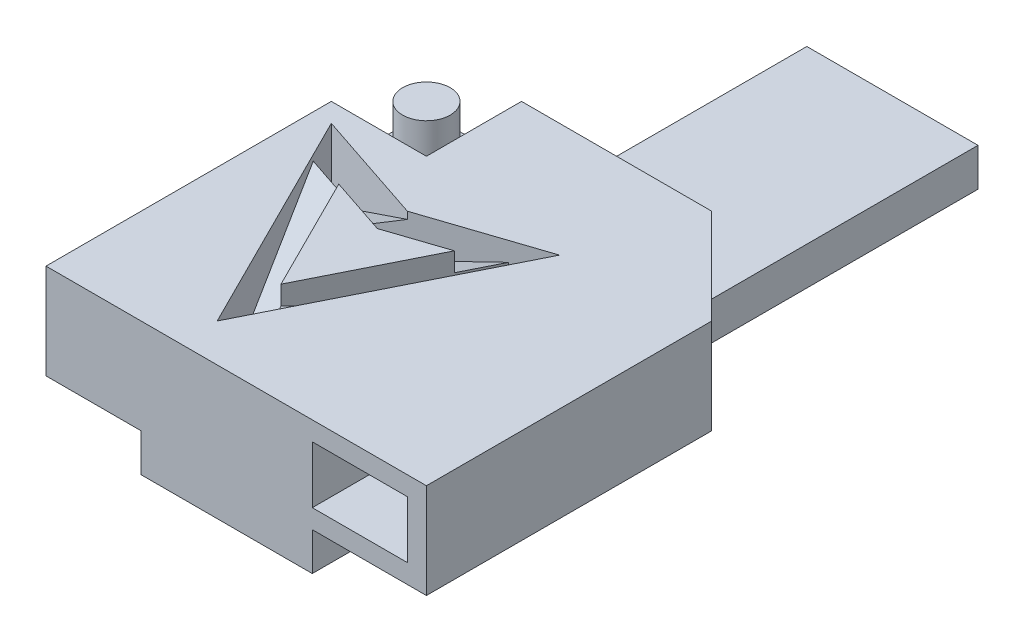
ISO-10303-21;
HEADER;
FILE_DESCRIPTION(('STEP AP214'),'2;1');
FILE_NAME('part.step','',(''),(''),'','','');
FILE_SCHEMA(('AUTOMOTIVE_DESIGN { 1 0 10303 214 1 1 1 1 }'));
ENDSEC;
DATA;
#1=APPLICATION_CONTEXT('core data for automotive mechanical design processes');
#2=APPLICATION_PROTOCOL_DEFINITION('international standard','automotive_design',2000,#1);
#3=PRODUCT_CONTEXT('',#1,'mechanical');
#4=PRODUCT('Part','Part','',(#3));
#5=PRODUCT_RELATED_PRODUCT_CATEGORY('part','',(#4));
#6=PRODUCT_DEFINITION_FORMATION('','',#4);
#7=PRODUCT_DEFINITION_CONTEXT('part definition',#1,'design');
#8=PRODUCT_DEFINITION('design','',#6,#7);
#9=PRODUCT_DEFINITION_SHAPE('','',#8);
#10=(LENGTH_UNIT() NAMED_UNIT(*) SI_UNIT(.MILLI.,.METRE.));
#11=(NAMED_UNIT(*) PLANE_ANGLE_UNIT() SI_UNIT($,.RADIAN.));
#12=(NAMED_UNIT(*) SI_UNIT($,.STERADIAN.) SOLID_ANGLE_UNIT());
#13=UNCERTAINTY_MEASURE_WITH_UNIT(LENGTH_MEASURE(1.E-05),#10,'distance_accuracy_value','');
#14=(GEOMETRIC_REPRESENTATION_CONTEXT(3) GLOBAL_UNCERTAINTY_ASSIGNED_CONTEXT((#13)) GLOBAL_UNIT_ASSIGNED_CONTEXT((#10,
#11,#12)) REPRESENTATION_CONTEXT('',''));
#15=CARTESIAN_POINT('',(0.,0.,0.));
#16=DIRECTION('',(0.,0.,1.));
#17=DIRECTION('',(1.,0.,0.));
#18=AXIS2_PLACEMENT_3D('',#15,#16,#17);
#19=CARTESIAN_POINT('',(0.,0.,0.));
#20=DIRECTION('',(0.,-1.,0.));
#21=DIRECTION('',(0.,0.,-1.));
#22=AXIS2_PLACEMENT_3D('',#19,#20,#21);
#23=PLANE('',#22);
#24=DIRECTION('',(1.,0.,0.));
#25=VECTOR('',#24,1.);
#26=CARTESIAN_POINT('',(-10.,0.,10.));
#27=LINE('',#26,#25);
#28=CARTESIAN_POINT('',(4.,0.,10.));
#29=VERTEX_POINT('',#28);
#30=CARTESIAN_POINT('',(10.,0.,10.));
#31=VERTEX_POINT('',#30);
#32=EDGE_CURVE('E59',#29,#31,#27,.T.);
#33=ORIENTED_EDGE('',*,*,#32,.F.);
#34=DIRECTION('',(0.,0.,-1.));
#35=VECTOR('',#34,1.);
#36=CARTESIAN_POINT('',(4.,0.,10.));
#37=LINE('',#36,#35);
#38=CARTESIAN_POINT('',(4.,0.,-10.));
#39=VERTEX_POINT('',#38);
#40=EDGE_CURVE('E1017',#29,#39,#37,.T.);
#41=ORIENTED_EDGE('',*,*,#40,.T.);
#42=DIRECTION('',(-1.,0.,0.));
#43=VECTOR('',#42,1.);
#44=CARTESIAN_POINT('',(-10.,0.,-10.));
#45=LINE('',#44,#43);
#46=CARTESIAN_POINT('',(5.,0.,-10.));
#47=VERTEX_POINT('',#46);
#48=EDGE_CURVE('E320',#47,#39,#45,.T.);
#49=ORIENTED_EDGE('',*,*,#48,.F.);
#50=DIRECTION('',(-0.707106781186547,0.,-0.707106781186548));
#51=VECTOR('',#50,1.);
#52=CARTESIAN_POINT('',(5.,0.,-10.));
#53=LINE('',#52,#51);
#54=CARTESIAN_POINT('',(10.,0.,-5.));
#55=VERTEX_POINT('',#54);
#56=EDGE_CURVE('E345',#55,#47,#53,.T.);
#57=ORIENTED_EDGE('',*,*,#56,.F.);
#58=DIRECTION('',(0.,0.,-1.));
#59=VECTOR('',#58,1.);
#60=CARTESIAN_POINT('',(10.,0.,10.));
#61=LINE('',#60,#59);
#62=EDGE_CURVE('E342',#31,#55,#61,.T.);
#63=ORIENTED_EDGE('',*,*,#62,.F.);
#64=EDGE_LOOP('',(#33,#41,#49,#57,#63));
#65=FACE_BOUND('',#64,.T.);
#66=ADVANCED_FACE('F43',(#65),#23,.T.);
#67=CARTESIAN_POINT('',(0.,2.,0.));
#68=DIRECTION('',(0.,1.,0.));
#69=DIRECTION('',(0.,0.,1.));
#70=AXIS2_PLACEMENT_3D('',#67,#68,#69);
#71=PLANE('',#70);
#72=DIRECTION('',(-0.948683298050514,0.,0.316227766016838));
#73=VECTOR('',#72,1.);
#74=CARTESIAN_POINT('',(-3.,2.,-2.));
#75=LINE('',#74,#73);
#76=CARTESIAN_POINT('',(3.,2.,-4.));
#77=VERTEX_POINT('',#76);
#78=CARTESIAN_POINT('',(0.987538820250192,2.,-3.32917960675006));
#79=VERTEX_POINT('',#78);
#80=EDGE_CURVE('E275',#77,#79,#75,.T.);
#81=ORIENTED_EDGE('',*,*,#80,.T.);
#82=DIRECTION('',(-0.447213595499957,0.,-0.894427190999916));
#83=VECTOR('',#82,1.);
#84=CARTESIAN_POINT('',(8.12259732609117,2.,10.9409374049319));
#85=LINE('',#84,#83);
#86=CARTESIAN_POINT('',(1.82606431181261,2.,-1.65212862362523));
#87=VERTEX_POINT('',#86);
#88=EDGE_CURVE('E416',#87,#79,#85,.T.);
#89=ORIENTED_EDGE('',*,*,#88,.F.);
#90=DIRECTION('',(0.447213595499958,0.,-0.894427190999916));
#91=VECTOR('',#90,1.);
#92=CARTESIAN_POINT('',(3.,2.,-4.));
#93=LINE('',#92,#91);
#94=EDGE_CURVE('E512',#87,#77,#93,.T.);
#95=ORIENTED_EDGE('',*,*,#94,.T.);
#96=EDGE_LOOP('',(#81,#89,#95));
#97=FACE_BOUND('',#96,.T.);
#98=ADVANCED_FACE('F544',(#97),#71,.T.);
#99=CARTESIAN_POINT('',(3.,2.,-4.));
#100=DIRECTION('',(0.894427190999916,0.,0.447213595499958));
#101=DIRECTION('',(0.447213595499958,0.,-0.894427190999916));
#102=AXIS2_PLACEMENT_3D('',#99,#100,#101);
#103=PLANE('',#102);
#104=DIRECTION('',(0.,-1.,0.));
#105=VECTOR('',#104,1.);
#106=CARTESIAN_POINT('',(-2.16147450843758,4.,6.32294901687516));
#107=LINE('',#106,#105);
#108=CARTESIAN_POINT('',(-2.16147450843758,4.,6.32294901687515));
#109=VERTEX_POINT('',#108);
#110=CARTESIAN_POINT('',(-2.16147450843758,2.,6.32294901687515));
#111=VERTEX_POINT('',#110);
#112=EDGE_CURVE('E402',#109,#111,#107,.T.);
#113=ORIENTED_EDGE('',*,*,#112,.T.);
#114=CARTESIAN_POINT('',(-3.,2.,8.));
#115=VERTEX_POINT('',#114);
#116=EDGE_CURVE('E532',#115,#111,#93,.T.);
#117=ORIENTED_EDGE('',*,*,#116,.F.);
#118=DIRECTION('',(0.,1.,0.));
#119=VECTOR('',#118,1.);
#120=CARTESIAN_POINT('',(-3.,2.,8.));
#121=LINE('',#120,#119);
#122=CARTESIAN_POINT('',(-3.,5.,8.));
#123=VERTEX_POINT('',#122);
#124=EDGE_CURVE('E515',#115,#123,#121,.T.);
#125=ORIENTED_EDGE('',*,*,#124,.T.);
#126=DIRECTION('',(0.447213595499958,0.,-0.894427190999916));
#127=VECTOR('',#126,1.);
#128=CARTESIAN_POINT('',(3.,5.,-4.));
#129=LINE('',#128,#127);
#130=CARTESIAN_POINT('',(3.,5.,-4.));
#131=VERTEX_POINT('',#130);
#132=EDGE_CURVE('E280',#123,#131,#129,.T.);
#133=ORIENTED_EDGE('',*,*,#132,.T.);
#134=DIRECTION('',(0.,1.,0.));
#135=VECTOR('',#134,1.);
#136=CARTESIAN_POINT('',(3.,2.,-4.));
#137=LINE('',#136,#135);
#138=EDGE_CURVE('E467',#77,#131,#137,.T.);
#139=ORIENTED_EDGE('',*,*,#138,.F.);
#140=ORIENTED_EDGE('',*,*,#94,.F.);
#141=DIRECTION('',(-0.436370747100067,0.218867209459637,0.872741494200133));
#142=VECTOR('',#141,1.);
#143=CARTESIAN_POINT('',(-1.77088235054016,3.80409361488152,5.54176470108032));
#144=LINE('',#143,#142);
#145=EDGE_CURVE('E419',#87,#109,#144,.T.);
#146=ORIENTED_EDGE('',*,*,#145,.T.);
#147=EDGE_LOOP('',(#113,#117,#125,#133,#139,#140,#146));
#148=FACE_BOUND('',#147,.T.);
#149=ADVANCED_FACE('F547',(#148),#103,.F.);
#150=CARTESIAN_POINT('',(0.0388555221996776,2.,-1.43181301064903));
#151=DIRECTION('',(0.894427190999916,0.,0.447213595499958));
#152=DIRECTION('',(0.447213595499958,0.,-0.894427190999916));
#153=AXIS2_PLACEMENT_3D('',#150,#151,#152);
#154=PLANE('',#153);
#155=DIRECTION('',(0.,1.,0.));
#156=VECTOR('',#155,1.);
#157=CARTESIAN_POINT('',(-3.,2.,4.64589803375032));
#158=LINE('',#157,#156);
#159=CARTESIAN_POINT('',(-3.,4.,4.64589803375032));
#160=VERTEX_POINT('',#159);
#161=CARTESIAN_POINT('',(-3.,5.,4.64589803375032));
#162=VERTEX_POINT('',#161);
#163=EDGE_CURVE('E293',#160,#162,#158,.T.);
#164=ORIENTED_EDGE('',*,*,#163,.F.);
#165=DIRECTION('',(-0.436370747100067,0.218867209459637,0.872741494200133));
#166=VECTOR('',#165,1.);
#167=CARTESIAN_POINT('',(0.987538820250192,2.,-3.32917960675006));
#168=LINE('',#167,#166);
#169=EDGE_CURVE('E410',#79,#160,#168,.T.);
#170=ORIENTED_EDGE('',*,*,#169,.F.);
#171=DIRECTION('',(0.,1.,0.));
#172=VECTOR('',#171,1.);
#173=CARTESIAN_POINT('',(0.987538820250192,4.,-3.32917960675006));
#174=LINE('',#173,#172);
#175=CARTESIAN_POINT('',(0.987538820250192,4.,-3.32917960675006));
#176=VERTEX_POINT('',#175);
#177=EDGE_CURVE('E439',#79,#176,#174,.T.);
#178=ORIENTED_EDGE('',*,*,#177,.T.);
#179=DIRECTION('',(0.447213595499958,0.,-0.894427190999916));
#180=VECTOR('',#179,1.);
#181=CARTESIAN_POINT('',(-6.54253521369087,4.,11.7309684611321));
#182=LINE('',#181,#180);
#183=CARTESIAN_POINT('',(0.0388555221996776,4.,-1.43181301064903));
#184=VERTEX_POINT('',#183);
#185=EDGE_CURVE('E431',#184,#176,#182,.T.);
#186=ORIENTED_EDGE('',*,*,#185,.F.);
#187=DIRECTION('',(0.,1.,0.));
#188=VECTOR('',#187,1.);
#189=CARTESIAN_POINT('',(0.0388555221996776,2.,-1.43181301064903));
#190=LINE('',#189,#188);
#191=CARTESIAN_POINT('',(0.0388555221996776,5.,-1.43181301064903));
#192=VERTEX_POINT('',#191);
#193=EDGE_CURVE('E296',#184,#192,#190,.T.);
#194=ORIENTED_EDGE('',*,*,#193,.T.);
#195=DIRECTION('',(0.447213595499958,0.,-0.894427190999916));
#196=VECTOR('',#195,1.);
#197=CARTESIAN_POINT('',(0.0388555221996776,5.,-1.43181301064903));
#198=LINE('',#197,#196);
#199=EDGE_CURVE('E289',#162,#192,#198,.T.);
#200=ORIENTED_EDGE('',*,*,#199,.F.);
#201=EDGE_LOOP('',(#164,#170,#178,#186,#194,#200));
#202=FACE_BOUND('',#201,.T.);
#203=ADVANCED_FACE('F557',(#202),#154,.T.);
#204=CARTESIAN_POINT('',(-6.03885552219967,2.,-1.43181301064903));
#205=DIRECTION('',(0.316227766016838,0.,-0.948683298050514));
#206=DIRECTION('',(-0.948683298050514,0.,-0.316227766016838));
#207=AXIS2_PLACEMENT_3D('',#204,#205,#206);
#208=PLANE('',#207);
#209=DIRECTION('',(0.,1.,0.));
#210=VECTOR('',#209,1.);
#211=CARTESIAN_POINT('',(-3.,2.,-0.418861169915809));
#212=LINE('',#211,#210);
#213=CARTESIAN_POINT('',(-3.,3.04427191113709,-0.418861169915804));
#214=VERTEX_POINT('',#213);
#215=CARTESIAN_POINT('',(-3.,5.,-0.418861169915809));
#216=VERTEX_POINT('',#215);
#217=EDGE_CURVE('E286',#214,#216,#212,.T.);
#218=ORIENTED_EDGE('',*,*,#217,.F.);
#219=DIRECTION('',(0.875383444305222,0.385434567780787,0.291794481435074));
#220=VECTOR('',#219,1.);
#221=CARTESIAN_POINT('',(-7.29513055392305,1.15311004443384,-1.85057135455682));
#222=LINE('',#221,#220);
#223=CARTESIAN_POINT('',(-5.37170824512629,2.,-1.2094305849579));
#224=VERTEX_POINT('',#223);
#225=EDGE_CURVE('E428',#224,#214,#222,.T.);
#226=ORIENTED_EDGE('',*,*,#225,.F.);
#227=DIRECTION('',(0.,-1.,0.));
#228=VECTOR('',#227,1.);
#229=CARTESIAN_POINT('',(-5.37170824512629,3.5,-1.2094305849579));
#230=LINE('',#229,#228);
#231=CARTESIAN_POINT('',(-5.37170824512628,3.5,-1.2094305849579));
#232=VERTEX_POINT('',#231);
#233=EDGE_CURVE('E438',#232,#224,#230,.T.);
#234=ORIENTED_EDGE('',*,*,#233,.F.);
#235=DIRECTION('',(0.837864106912505,0.469022314498422,0.279288035637501));
#236=VECTOR('',#235,1.);
#237=CARTESIAN_POINT('',(-8.05131670194948,2.,-2.10263340389896));
#238=LINE('',#237,#236);
#239=CARTESIAN_POINT('',(-8.05131670194949,1.99999999999999,-2.10263340389897));
#240=VERTEX_POINT('',#239);
#241=EDGE_CURVE('E445',#240,#232,#238,.T.);
#242=ORIENTED_EDGE('',*,*,#241,.F.);
#243=DIRECTION('',(0.,-1.,0.));
#244=VECTOR('',#243,1.);
#245=CARTESIAN_POINT('',(-8.05131670194948,2.,-2.10263340389897));
#246=LINE('',#245,#244);
#247=CARTESIAN_POINT('',(-8.05131670194948,4.7,-2.10263340389897));
#248=VERTEX_POINT('',#247);
#249=EDGE_CURVE('E463',#248,#240,#246,.T.);
#250=ORIENTED_EDGE('',*,*,#249,.F.);
#251=DIRECTION('',(0.948683298050514,0.,0.316227766016838));
#252=VECTOR('',#251,1.);
#253=CARTESIAN_POINT('',(-17.9923105362645,4.7,-5.41629801533731));
#254=LINE('',#253,#252);
#255=CARTESIAN_POINT('',(-6.03885552219967,4.7,-1.43181301064903));
#256=VERTEX_POINT('',#255);
#257=EDGE_CURVE('E455',#248,#256,#254,.T.);
#258=ORIENTED_EDGE('',*,*,#257,.T.);
#259=DIRECTION('',(0.,1.,0.));
#260=VECTOR('',#259,1.);
#261=CARTESIAN_POINT('',(-6.03885552219967,2.,-1.43181301064903));
#262=LINE('',#261,#260);
#263=CARTESIAN_POINT('',(-6.03885552219967,5.,-1.43181301064903));
#264=VERTEX_POINT('',#263);
#265=EDGE_CURVE('E290',#256,#264,#262,.T.);
#266=ORIENTED_EDGE('',*,*,#265,.T.);
#267=DIRECTION('',(-0.948683298050514,0.,-0.316227766016838));
#268=VECTOR('',#267,1.);
#269=CARTESIAN_POINT('',(-6.03885552219967,5.,-1.43181301064903));
#270=LINE('',#269,#268);
#271=EDGE_CURVE('E307',#216,#264,#270,.T.);
#272=ORIENTED_EDGE('',*,*,#271,.F.);
#273=EDGE_LOOP('',(#218,#226,#234,#242,#250,#258,#266,#272));
#274=FACE_BOUND('',#273,.T.);
#275=ADVANCED_FACE('F583',(#274),#208,.T.);
#276=CARTESIAN_POINT('',(-3.,2.,-2.));
#277=DIRECTION('',(-0.316227766016838,0.,-0.948683298050514));
#278=DIRECTION('',(-0.948683298050514,0.,0.316227766016838));
#279=AXIS2_PLACEMENT_3D('',#276,#277,#278);
#280=PLANE('',#279);
#281=DIRECTION('',(0.,1.,0.));
#282=VECTOR('',#281,1.);
#283=CARTESIAN_POINT('',(-3.,2.,-2.));
#284=LINE('',#283,#282);
#285=CARTESIAN_POINT('',(-2.99999999999999,4.625,-2.));
#286=VERTEX_POINT('',#285);
#287=CARTESIAN_POINT('',(-3.,5.,-2.));
#288=VERTEX_POINT('',#287);
#289=EDGE_CURVE('E509',#286,#288,#284,.T.);
#290=ORIENTED_EDGE('',*,*,#289,.F.);
#291=DIRECTION('',(-0.865124701092709,-0.410364677328797,0.288374900364236));
#292=VECTOR('',#291,1.);
#293=CARTESIAN_POINT('',(-5.37170824512628,3.5,-1.20943058495791));
#294=LINE('',#293,#292);
#295=EDGE_CURVE('E256',#286,#232,#294,.T.);
#296=ORIENTED_EDGE('',*,*,#295,.T.);
#297=ORIENTED_EDGE('',*,*,#233,.T.);
#298=DIRECTION('',(-0.909082260596594,-0.285908772296701,0.303027420198865));
#299=VECTOR('',#298,1.);
#300=CARTESIAN_POINT('',(-5.37170824512629,2.,-1.2094305849579));
#301=LINE('',#300,#299);
#302=EDGE_CURVE('E435',#176,#224,#301,.T.);
#303=ORIENTED_EDGE('',*,*,#302,.F.);
#304=ORIENTED_EDGE('',*,*,#177,.F.);
#305=ORIENTED_EDGE('',*,*,#80,.F.);
#306=ORIENTED_EDGE('',*,*,#138,.T.);
#307=DIRECTION('',(-0.948683298050514,0.,0.316227766016838));
#308=VECTOR('',#307,1.);
#309=CARTESIAN_POINT('',(-3.,5.,-2.));
#310=LINE('',#309,#308);
#311=EDGE_CURVE('E299',#131,#288,#310,.T.);
#312=ORIENTED_EDGE('',*,*,#311,.T.);
#313=EDGE_LOOP('',(#290,#296,#297,#303,#304,#305,#306,#312));
#314=FACE_BOUND('',#313,.T.);
#315=ADVANCED_FACE('F552',(#314),#280,.F.);
#316=CARTESIAN_POINT('',(-3.,2.,-0.418861169915809));
#317=DIRECTION('',(-0.316227766016838,0.,-0.948683298050514));
#318=DIRECTION('',(-0.948683298050514,0.,0.316227766016838));
#319=AXIS2_PLACEMENT_3D('',#316,#317,#318);
#320=PLANE('',#319);
#321=ORIENTED_EDGE('',*,*,#193,.F.);
#322=DIRECTION('',(0.909082260596594,0.285908772296701,-0.303027420198865));
#323=VECTOR('',#322,1.);
#324=CARTESIAN_POINT('',(-15.3854955575313,-0.850999157969609,3.7096373492613));
#325=LINE('',#324,#323);
#326=EDGE_CURVE('E414',#214,#184,#325,.T.);
#327=ORIENTED_EDGE('',*,*,#326,.F.);
#328=ORIENTED_EDGE('',*,*,#217,.T.);
#329=DIRECTION('',(-0.948683298050514,0.,0.316227766016838));
#330=VECTOR('',#329,1.);
#331=CARTESIAN_POINT('',(-3.,5.,-0.418861169915809));
#332=LINE('',#331,#330);
#333=EDGE_CURVE('E311',#192,#216,#332,.T.);
#334=ORIENTED_EDGE('',*,*,#333,.F.);
#335=EDGE_LOOP('',(#321,#327,#328,#334));
#336=FACE_BOUND('',#335,.T.);
#337=ADVANCED_FACE('F590',(#336),#320,.T.);
#338=DIRECTION('',(0.240586075025283,0.,-0.970627807402986));
#339=VECTOR('',#338,1.);
#340=CARTESIAN_POINT('',(-7.91736341240443,2.,-2.64305864551724));
#341=LINE('',#340,#339);
#342=CARTESIAN_POINT('',(-7.68931479944057,2.,-3.56310493314686));
#343=VERTEX_POINT('',#342);
#344=EDGE_CURVE('E254',#240,#343,#341,.T.);
#345=ORIENTED_EDGE('',*,*,#344,.T.);
#346=DIRECTION('',(-0.948683298050514,0.,-0.316227766016838));
#347=VECTOR('',#346,1.);
#348=CARTESIAN_POINT('',(-9.,2.,-4.));
#349=LINE('',#348,#347);
#350=CARTESIAN_POINT('',(-9.,2.,-4.));
#351=VERTEX_POINT('',#350);
#352=EDGE_CURVE('E265',#343,#351,#349,.T.);
#353=ORIENTED_EDGE('',*,*,#352,.T.);
#354=DIRECTION('',(0.447213595499958,0.,0.894427190999916));
#355=VECTOR('',#354,1.);
#356=CARTESIAN_POINT('',(-3.,2.,8.));
#357=LINE('',#356,#355);
#358=EDGE_CURVE('E268',#351,#240,#357,.T.);
#359=ORIENTED_EDGE('',*,*,#358,.T.);
#360=EDGE_LOOP('',(#345,#353,#359));
#361=FACE_BOUND('',#360,.T.);
#362=ADVANCED_FACE('F264',(#361),#71,.T.);
#363=CARTESIAN_POINT('',(-9.,2.,-4.));
#364=DIRECTION('',(0.316227766016838,0.,-0.948683298050514));
#365=DIRECTION('',(-0.948683298050514,0.,-0.316227766016838));
#366=AXIS2_PLACEMENT_3D('',#363,#364,#365);
#367=PLANE('',#366);
#368=ORIENTED_EDGE('',*,*,#352,.F.);
#369=DIRECTION('',(0.837864106912505,0.469022314498422,0.279288035637501));
#370=VECTOR('',#369,1.);
#371=CARTESIAN_POINT('',(-12.3913053018035,-0.632095646505792,-5.13043510060117));
#372=LINE('',#371,#370);
#373=EDGE_CURVE('E250',#343,#286,#372,.T.);
#374=ORIENTED_EDGE('',*,*,#373,.T.);
#375=ORIENTED_EDGE('',*,*,#289,.T.);
#376=DIRECTION('',(-0.948683298050514,0.,-0.316227766016838));
#377=VECTOR('',#376,1.);
#378=CARTESIAN_POINT('',(-9.,5.,-4.));
#379=LINE('',#378,#377);
#380=CARTESIAN_POINT('',(-9.,5.,-4.));
#381=VERTEX_POINT('',#380);
#382=EDGE_CURVE('E527',#288,#381,#379,.T.);
#383=ORIENTED_EDGE('',*,*,#382,.T.);
#384=DIRECTION('',(0.,1.,0.));
#385=VECTOR('',#384,1.);
#386=CARTESIAN_POINT('',(-9.,2.,-4.));
#387=LINE('',#386,#385);
#388=EDGE_CURVE('E273',#351,#381,#387,.T.);
#389=ORIENTED_EDGE('',*,*,#388,.F.);
#390=EDGE_LOOP('',(#368,#374,#375,#383,#389));
#391=FACE_BOUND('',#390,.T.);
#392=ADVANCED_FACE('F271',(#391),#367,.F.);
#393=CARTESIAN_POINT('',(-3.,2.,8.));
#394=DIRECTION('',(-0.894427190999916,0.,0.447213595499958));
#395=DIRECTION('',(0.447213595499958,0.,0.894427190999916));
#396=AXIS2_PLACEMENT_3D('',#393,#394,#395);
#397=PLANE('',#396);
#398=DIRECTION('',(-0.426988043772352,0.297331552946034,-0.853976087544704));
#399=VECTOR('',#398,1.);
#400=CARTESIAN_POINT('',(-11.0720333061882,6.80346489099123,-8.1440666123764));
#401=LINE('',#400,#399);
#402=CARTESIAN_POINT('',(-4.17393568818739,2.,5.65212862362522));
#403=VERTEX_POINT('',#402);
#404=EDGE_CURVE('E459',#403,#248,#401,.T.);
#405=ORIENTED_EDGE('',*,*,#404,.T.);
#406=ORIENTED_EDGE('',*,*,#249,.T.);
#407=ORIENTED_EDGE('',*,*,#358,.F.);
#408=ORIENTED_EDGE('',*,*,#388,.T.);
#409=DIRECTION('',(0.447213595499958,0.,0.894427190999916));
#410=VECTOR('',#409,1.);
#411=CARTESIAN_POINT('',(-3.,5.,8.));
#412=LINE('',#411,#410);
#413=EDGE_CURVE('E523',#381,#123,#412,.T.);
#414=ORIENTED_EDGE('',*,*,#413,.T.);
#415=ORIENTED_EDGE('',*,*,#124,.F.);
#416=EDGE_CURVE('E282',#403,#115,#357,.T.);
#417=ORIENTED_EDGE('',*,*,#416,.F.);
#418=EDGE_LOOP('',(#405,#406,#407,#408,#414,#415,#417));
#419=FACE_BOUND('',#418,.T.);
#420=ADVANCED_FACE('F570',(#419),#397,.F.);
#421=ORIENTED_EDGE('',*,*,#116,.T.);
#422=DIRECTION('',(0.948683298050514,0.,0.316227766016838));
#423=VECTOR('',#422,1.);
#424=CARTESIAN_POINT('',(-14.1149295225024,2.,2.33846401218688));
#425=LINE('',#424,#423);
#426=EDGE_CURVE('E454',#403,#111,#425,.T.);
#427=ORIENTED_EDGE('',*,*,#426,.F.);
#428=ORIENTED_EDGE('',*,*,#416,.T.);
#429=EDGE_LOOP('',(#421,#427,#428));
#430=FACE_BOUND('',#429,.T.);
#431=ADVANCED_FACE('F567',(#430),#71,.T.);
#432=CARTESIAN_POINT('',(-3.,2.,4.64589803375032));
#433=DIRECTION('',(-0.894427190999916,0.,0.447213595499958));
#434=DIRECTION('',(0.447213595499958,0.,0.894427190999916));
#435=AXIS2_PLACEMENT_3D('',#432,#433,#434);
#436=PLANE('',#435);
#437=ORIENTED_EDGE('',*,*,#265,.F.);
#438=DIRECTION('',(-0.426988043772353,0.297331552946034,-0.853976087544704));
#439=VECTOR('',#438,1.);
#440=CARTESIAN_POINT('',(-6.03885552219968,4.7,-1.43181301064903));
#441=LINE('',#440,#439);
#442=EDGE_CURVE('E448',#111,#256,#441,.T.);
#443=ORIENTED_EDGE('',*,*,#442,.F.);
#444=ORIENTED_EDGE('',*,*,#112,.F.);
#445=DIRECTION('',(-0.447213595499957,0.,-0.894427190999916));
#446=VECTOR('',#445,1.);
#447=CARTESIAN_POINT('',(4.13505850584098,4.,18.9160150454323));
#448=LINE('',#447,#446);
#449=EDGE_CURVE('E415',#109,#160,#448,.T.);
#450=ORIENTED_EDGE('',*,*,#449,.T.);
#451=ORIENTED_EDGE('',*,*,#163,.T.);
#452=DIRECTION('',(0.447213595499958,0.,0.894427190999916));
#453=VECTOR('',#452,1.);
#454=CARTESIAN_POINT('',(-3.,5.,4.64589803375032));
#455=LINE('',#454,#453);
#456=EDGE_CURVE('E303',#264,#162,#455,.T.);
#457=ORIENTED_EDGE('',*,*,#456,.F.);
#458=EDGE_LOOP('',(#437,#443,#444,#450,#451,#457));
#459=FACE_BOUND('',#458,.T.);
#460=ADVANCED_FACE('F596',(#459),#436,.T.);
#461=CARTESIAN_POINT('',(-10.,5.,10.));
#462=DIRECTION('',(1.,0.,0.));
#463=DIRECTION('',(0.,0.,-1.));
#464=AXIS2_PLACEMENT_3D('',#461,#462,#463);
#465=PLANE('',#464);
#466=DIRECTION('',(0.,0.,1.));
#467=VECTOR('',#466,1.);
#468=CARTESIAN_POINT('',(-10.,5.,10.));
#469=LINE('',#468,#467);
#470=CARTESIAN_POINT('',(-10.,5.,-5.));
#471=VERTEX_POINT('',#470);
#472=CARTESIAN_POINT('',(-10.,5.,10.));
#473=VERTEX_POINT('',#472);
#474=EDGE_CURVE('E316',#471,#473,#469,.T.);
#475=ORIENTED_EDGE('',*,*,#474,.F.);
#476=DIRECTION('',(0.,1.,0.));
#477=VECTOR('',#476,1.);
#478=CARTESIAN_POINT('',(-10.,2.,-5.));
#479=LINE('',#478,#477);
#480=CARTESIAN_POINT('',(-10.,2.,-5.));
#481=VERTEX_POINT('',#480);
#482=EDGE_CURVE('E495',#481,#471,#479,.T.);
#483=ORIENTED_EDGE('',*,*,#482,.F.);
#484=DIRECTION('',(0.,0.,1.));
#485=VECTOR('',#484,1.);
#486=CARTESIAN_POINT('',(-10.,2.,-10.));
#487=LINE('',#486,#485);
#488=CARTESIAN_POINT('',(-10.,2.,-10.));
#489=VERTEX_POINT('',#488);
#490=EDGE_CURVE('E479',#489,#481,#487,.T.);
#491=ORIENTED_EDGE('',*,*,#490,.F.);
#492=DIRECTION('',(0.,-1.,0.));
#493=VECTOR('',#492,1.);
#494=CARTESIAN_POINT('',(-10.,5.,-10.));
#495=LINE('',#494,#493);
#496=CARTESIAN_POINT('',(-10.,0.,-10.));
#497=VERTEX_POINT('',#496);
#498=EDGE_CURVE('E333',#489,#497,#495,.T.);
#499=ORIENTED_EDGE('',*,*,#498,.T.);
#500=DIRECTION('',(0.,0.,1.));
#501=VECTOR('',#500,1.);
#502=CARTESIAN_POINT('',(-10.,0.,10.));
#503=LINE('',#502,#501);
#504=CARTESIAN_POINT('',(-10.,0.,10.));
#505=VERTEX_POINT('',#504);
#506=EDGE_CURVE('E334',#497,#505,#503,.T.);
#507=ORIENTED_EDGE('',*,*,#506,.T.);
#508=DIRECTION('',(0.,-1.,0.));
#509=VECTOR('',#508,1.);
#510=CARTESIAN_POINT('',(-10.,5.,10.));
#511=LINE('',#510,#509);
#512=EDGE_CURVE('E370',#473,#505,#511,.T.);
#513=ORIENTED_EDGE('',*,*,#512,.F.);
#514=EDGE_LOOP('',(#475,#483,#491,#499,#507,#513));
#515=FACE_BOUND('',#514,.T.);
#516=ADVANCED_FACE('F45',(#515),#465,.F.);
#517=CARTESIAN_POINT('',(-10.,5.,10.));
#518=DIRECTION('',(0.,0.,-1.));
#519=DIRECTION('',(-1.,0.,0.));
#520=AXIS2_PLACEMENT_3D('',#517,#518,#519);
#521=PLANE('',#520);
#522=DIRECTION('',(-1.,0.,0.));
#523=VECTOR('',#522,1.);
#524=CARTESIAN_POINT('',(9.,4.,10.));
#525=LINE('',#524,#523);
#526=CARTESIAN_POINT('',(9.,4.,10.));
#527=VERTEX_POINT('',#526);
#528=CARTESIAN_POINT('',(4.,4.,10.));
#529=VERTEX_POINT('',#528);
#530=EDGE_CURVE('E1015',#527,#529,#525,.T.);
#531=ORIENTED_EDGE('',*,*,#530,.F.);
#532=DIRECTION('',(0.,1.,0.));
#533=VECTOR('',#532,1.);
#534=CARTESIAN_POINT('',(9.,1.,10.));
#535=LINE('',#534,#533);
#536=CARTESIAN_POINT('',(9.,1.,10.));
#537=VERTEX_POINT('',#536);
#538=EDGE_CURVE('E1003',#537,#527,#535,.T.);
#539=ORIENTED_EDGE('',*,*,#538,.F.);
#540=DIRECTION('',(1.,0.,0.));
#541=VECTOR('',#540,1.);
#542=CARTESIAN_POINT('',(9.,1.,10.));
#543=LINE('',#542,#541);
#544=CARTESIAN_POINT('',(4.,1.,10.));
#545=VERTEX_POINT('',#544);
#546=EDGE_CURVE('E1005',#545,#537,#543,.T.);
#547=ORIENTED_EDGE('',*,*,#546,.F.);
#548=DIRECTION('',(0.,-1.,0.));
#549=VECTOR('',#548,1.);
#550=CARTESIAN_POINT('',(4.,1.,10.));
#551=LINE('',#550,#549);
#552=EDGE_CURVE('E1011',#529,#545,#551,.T.);
#553=ORIENTED_EDGE('',*,*,#552,.F.);
#554=EDGE_LOOP('',(#531,#539,#547,#553));
#555=FACE_BOUND('',#554,.T.);
#556=CARTESIAN_POINT('',(-5.,0.,10.));
#557=VERTEX_POINT('',#556);
#558=EDGE_CURVE('E339',#505,#557,#27,.T.);
#559=ORIENTED_EDGE('',*,*,#558,.T.);
#560=DIRECTION('',(0.,1.,0.));
#561=VECTOR('',#560,1.);
#562=CARTESIAN_POINT('',(-5.,0.,10.));
#563=LINE('',#562,#561);
#564=CARTESIAN_POINT('',(-5.,-2.,10.));
#565=VERTEX_POINT('',#564);
#566=EDGE_CURVE('E1040',#565,#557,#563,.T.);
#567=ORIENTED_EDGE('',*,*,#566,.F.);
#568=DIRECTION('',(-1.,0.,0.));
#569=VECTOR('',#568,1.);
#570=CARTESIAN_POINT('',(4.,-2.,10.));
#571=LINE('',#570,#569);
#572=CARTESIAN_POINT('',(4.,-2.,10.));
#573=VERTEX_POINT('',#572);
#574=EDGE_CURVE('E1049',#573,#565,#571,.T.);
#575=ORIENTED_EDGE('',*,*,#574,.F.);
#576=DIRECTION('',(0.,-1.,0.));
#577=VECTOR('',#576,1.);
#578=CARTESIAN_POINT('',(4.,0.,10.));
#579=LINE('',#578,#577);
#580=EDGE_CURVE('E1053',#29,#573,#579,.T.);
#581=ORIENTED_EDGE('',*,*,#580,.F.);
#582=ORIENTED_EDGE('',*,*,#32,.T.);
#583=DIRECTION('',(0.,-1.,0.));
#584=VECTOR('',#583,1.);
#585=CARTESIAN_POINT('',(10.,5.,10.));
#586=LINE('',#585,#584);
#587=CARTESIAN_POINT('',(10.,5.,10.));
#588=VERTEX_POINT('',#587);
#589=EDGE_CURVE('E366',#588,#31,#586,.T.);
#590=ORIENTED_EDGE('',*,*,#589,.F.);
#591=DIRECTION('',(1.,0.,0.));
#592=VECTOR('',#591,1.);
#593=CARTESIAN_POINT('',(-10.,5.,10.));
#594=LINE('',#593,#592);
#595=EDGE_CURVE('E319',#473,#588,#594,.T.);
#596=ORIENTED_EDGE('',*,*,#595,.F.);
#597=ORIENTED_EDGE('',*,*,#512,.T.);
#598=EDGE_LOOP('',(#559,#567,#575,#581,#582,#590,#596,#597));
#599=FACE_BOUND('',#598,.T.);
#600=ADVANCED_FACE('F603',(#555,#599),#521,.F.);
#601=CARTESIAN_POINT('',(10.,5.,10.));
#602=DIRECTION('',(-1.,0.,0.));
#603=DIRECTION('',(0.,0.,1.));
#604=AXIS2_PLACEMENT_3D('',#601,#602,#603);
#605=PLANE('',#604);
#606=ORIENTED_EDGE('',*,*,#62,.T.);
#607=DIRECTION('',(0.,-1.,0.));
#608=VECTOR('',#607,1.);
#609=CARTESIAN_POINT('',(10.,5.,-5.));
#610=LINE('',#609,#608);
#611=CARTESIAN_POINT('',(10.,5.,-5.));
#612=VERTEX_POINT('',#611);
#613=EDGE_CURVE('E362',#612,#55,#610,.T.);
#614=ORIENTED_EDGE('',*,*,#613,.F.);
#615=DIRECTION('',(0.,0.,-1.));
#616=VECTOR('',#615,1.);
#617=CARTESIAN_POINT('',(10.,5.,10.));
#618=LINE('',#617,#616);
#619=EDGE_CURVE('E323',#588,#612,#618,.T.);
#620=ORIENTED_EDGE('',*,*,#619,.F.);
#621=ORIENTED_EDGE('',*,*,#589,.T.);
#622=EDGE_LOOP('',(#606,#614,#620,#621));
#623=FACE_BOUND('',#622,.T.);
#624=ADVANCED_FACE('F758',(#623),#605,.F.);
#625=CARTESIAN_POINT('',(5.,5.,-10.));
#626=DIRECTION('',(-0.707106781186548,0.,0.707106781186547));
#627=DIRECTION('',(0.707106781186547,0.,0.707106781186548));
#628=AXIS2_PLACEMENT_3D('',#625,#626,#627);
#629=PLANE('',#628);
#630=DIRECTION('',(0.,-1.,0.));
#631=VECTOR('',#630,1.);
#632=CARTESIAN_POINT('',(5.,5.,-10.));
#633=LINE('',#632,#631);
#634=CARTESIAN_POINT('',(5.,1.,-10.));
#635=VERTEX_POINT('',#634);
#636=EDGE_CURVE('E357',#635,#47,#633,.T.);
#637=ORIENTED_EDGE('',*,*,#636,.F.);
#638=DIRECTION('',(0.707106781186547,0.,0.707106781186548));
#639=VECTOR('',#638,1.);
#640=CARTESIAN_POINT('',(5.,0.999999999999999,-10.));
#641=LINE('',#640,#639);
#642=CARTESIAN_POINT('',(9.,1.,-5.99999999999999));
#643=VERTEX_POINT('',#642);
#644=EDGE_CURVE('E397',#635,#643,#641,.T.);
#645=ORIENTED_EDGE('',*,*,#644,.T.);
#646=DIRECTION('',(0.,1.,0.));
#647=VECTOR('',#646,1.);
#648=CARTESIAN_POINT('',(9.,5.,-6.));
#649=LINE('',#648,#647);
#650=CARTESIAN_POINT('',(9.,4.,-5.99999999999999));
#651=VERTEX_POINT('',#650);
#652=EDGE_CURVE('E11',#643,#651,#649,.T.);
#653=ORIENTED_EDGE('',*,*,#652,.T.);
#654=DIRECTION('',(-0.707106781186547,0.,-0.707106781186548));
#655=VECTOR('',#654,1.);
#656=CARTESIAN_POINT('',(5.,4.,-10.));
#657=LINE('',#656,#655);
#658=CARTESIAN_POINT('',(5.,4.,-10.));
#659=VERTEX_POINT('',#658);
#660=EDGE_CURVE('E387',#651,#659,#657,.T.);
#661=ORIENTED_EDGE('',*,*,#660,.T.);
#662=CARTESIAN_POINT('',(5.,5.,-10.));
#663=VERTEX_POINT('',#662);
#664=EDGE_CURVE('E358',#663,#659,#633,.T.);
#665=ORIENTED_EDGE('',*,*,#664,.F.);
#666=DIRECTION('',(-0.707106781186547,0.,-0.707106781186548));
#667=VECTOR('',#666,1.);
#668=CARTESIAN_POINT('',(5.,5.,-10.));
#669=LINE('',#668,#667);
#670=EDGE_CURVE('E326',#612,#663,#669,.T.);
#671=ORIENTED_EDGE('',*,*,#670,.F.);
#672=ORIENTED_EDGE('',*,*,#613,.T.);
#673=ORIENTED_EDGE('',*,*,#56,.T.);
#674=EDGE_LOOP('',(#637,#645,#653,#661,#665,#671,#672,#673));
#675=FACE_BOUND('',#674,.T.);
#676=ADVANCED_FACE('F393',(#675),#629,.F.);
#677=CARTESIAN_POINT('',(-10.,5.,-10.));
#678=DIRECTION('',(0.,0.,1.));
#679=DIRECTION('',(1.,0.,0.));
#680=AXIS2_PLACEMENT_3D('',#677,#678,#679);
#681=PLANE('',#680);
#682=DIRECTION('',(0.,-1.,0.));
#683=VECTOR('',#682,1.);
#684=CARTESIAN_POINT('',(4.,1.,-10.));
#685=LINE('',#684,#683);
#686=CARTESIAN_POINT('',(4.,4.,-10.));
#687=VERTEX_POINT('',#686);
#688=CARTESIAN_POINT('',(4.,1.,-10.));
#689=VERTEX_POINT('',#688);
#690=EDGE_CURVE('E379',#687,#689,#685,.T.);
#691=ORIENTED_EDGE('',*,*,#690,.T.);
#692=DIRECTION('',(1.,0.,0.));
#693=VECTOR('',#692,1.);
#694=CARTESIAN_POINT('',(9.,1.,-10.));
#695=LINE('',#694,#693);
#696=EDGE_CURVE('E1025',#689,#635,#695,.T.);
#697=ORIENTED_EDGE('',*,*,#696,.T.);
#698=ORIENTED_EDGE('',*,*,#636,.T.);
#699=ORIENTED_EDGE('',*,*,#48,.T.);
#700=CARTESIAN_POINT('',(-5.,0.,-10.));
#701=VERTEX_POINT('',#700);
#702=EDGE_CURVE('E353',#39,#701,#45,.T.);
#703=ORIENTED_EDGE('',*,*,#702,.T.);
#704=EDGE_CURVE('E349',#701,#497,#45,.T.);
#705=ORIENTED_EDGE('',*,*,#704,.T.);
#706=ORIENTED_EDGE('',*,*,#498,.F.);
#707=DIRECTION('',(-1.,0.,0.));
#708=VECTOR('',#707,1.);
#709=CARTESIAN_POINT('',(-10.,2.,-10.));
#710=LINE('',#709,#708);
#711=CARTESIAN_POINT('',(-5.,2.,-10.));
#712=VERTEX_POINT('',#711);
#713=EDGE_CURVE('E492',#712,#489,#710,.T.);
#714=ORIENTED_EDGE('',*,*,#713,.F.);
#715=DIRECTION('',(0.,1.,0.));
#716=VECTOR('',#715,1.);
#717=CARTESIAN_POINT('',(-5.,2.,-10.));
#718=LINE('',#717,#716);
#719=CARTESIAN_POINT('',(-5.,5.,-10.));
#720=VERTEX_POINT('',#719);
#721=EDGE_CURVE('E338',#712,#720,#718,.T.);
#722=ORIENTED_EDGE('',*,*,#721,.T.);
#723=DIRECTION('',(-1.,0.,0.));
#724=VECTOR('',#723,1.);
#725=CARTESIAN_POINT('',(-10.,5.,-10.));
#726=LINE('',#725,#724);
#727=EDGE_CURVE('E329',#663,#720,#726,.T.);
#728=ORIENTED_EDGE('',*,*,#727,.F.);
#729=ORIENTED_EDGE('',*,*,#664,.T.);
#730=DIRECTION('',(-1.,0.,0.));
#731=VECTOR('',#730,1.);
#732=CARTESIAN_POINT('',(-10.,4.,-10.));
#733=LINE('',#732,#731);
#734=EDGE_CURVE('E52',#659,#687,#733,.T.);
#735=ORIENTED_EDGE('',*,*,#734,.T.);
#736=EDGE_LOOP('',(#691,#697,#698,#699,#703,#705,#706,#714,#722,#728,#729,#735));
#737=FACE_BOUND('',#736,.T.);
#738=ADVANCED_FACE('F377',(#737),#681,.F.);
#739=CARTESIAN_POINT('',(0.,5.,0.));
#740=DIRECTION('',(0.,-1.,0.));
#741=DIRECTION('',(0.,0.,-1.));
#742=AXIS2_PLACEMENT_3D('',#739,#740,#741);
#743=PLANE('',#742);
#744=ORIENTED_EDGE('',*,*,#382,.F.);
#745=ORIENTED_EDGE('',*,*,#311,.F.);
#746=ORIENTED_EDGE('',*,*,#132,.F.);
#747=ORIENTED_EDGE('',*,*,#413,.F.);
#748=EDGE_LOOP('',(#744,#745,#746,#747));
#749=FACE_BOUND('',#748,.T.);
#750=ORIENTED_EDGE('',*,*,#727,.T.);
#751=DIRECTION('',(0.,0.,-1.));
#752=VECTOR('',#751,1.);
#753=CARTESIAN_POINT('',(-5.,5.,-10.));
#754=LINE('',#753,#752);
#755=CARTESIAN_POINT('',(-5.,5.,-5.));
#756=VERTEX_POINT('',#755);
#757=EDGE_CURVE('E484',#756,#720,#754,.T.);
#758=ORIENTED_EDGE('',*,*,#757,.F.);
#759=DIRECTION('',(1.,0.,0.));
#760=VECTOR('',#759,1.);
#761=CARTESIAN_POINT('',(-10.,5.,-5.));
#762=LINE('',#761,#760);
#763=EDGE_CURVE('E475',#471,#756,#762,.T.);
#764=ORIENTED_EDGE('',*,*,#763,.F.);
#765=ORIENTED_EDGE('',*,*,#474,.T.);
#766=ORIENTED_EDGE('',*,*,#595,.T.);
#767=ORIENTED_EDGE('',*,*,#619,.T.);
#768=ORIENTED_EDGE('',*,*,#670,.T.);
#769=EDGE_LOOP('',(#750,#758,#764,#765,#766,#767,#768));
#770=FACE_BOUND('',#769,.T.);
#771=ADVANCED_FACE('F574',(#749,#770),#743,.F.);
#772=DIRECTION('',(0.,0.,-1.));
#773=VECTOR('',#772,1.);
#774=CARTESIAN_POINT('',(-5.,0.,10.));
#775=LINE('',#774,#773);
#776=EDGE_CURVE('E67',#557,#701,#775,.T.);
#777=ORIENTED_EDGE('',*,*,#776,.F.);
#778=ORIENTED_EDGE('',*,*,#558,.F.);
#779=ORIENTED_EDGE('',*,*,#506,.F.);
#780=ORIENTED_EDGE('',*,*,#704,.F.);
#781=EDGE_LOOP('',(#777,#778,#779,#780));
#782=FACE_BOUND('',#781,.T.);
#783=ADVANCED_FACE('F610',(#782),#23,.T.);
#784=CARTESIAN_POINT('',(-5.,2.,-10.));
#785=DIRECTION('',(1.,0.,0.));
#786=DIRECTION('',(0.,0.,-1.));
#787=AXIS2_PLACEMENT_3D('',#784,#785,#786);
#788=PLANE('',#787);
#789=ORIENTED_EDGE('',*,*,#757,.T.);
#790=ORIENTED_EDGE('',*,*,#721,.F.);
#791=DIRECTION('',(0.,0.,-1.));
#792=VECTOR('',#791,1.);
#793=CARTESIAN_POINT('',(-5.,2.,-10.));
#794=LINE('',#793,#792);
#795=CARTESIAN_POINT('',(-5.,2.,-5.));
#796=VERTEX_POINT('',#795);
#797=EDGE_CURVE('E488',#796,#712,#794,.T.);
#798=ORIENTED_EDGE('',*,*,#797,.F.);
#799=DIRECTION('',(0.,1.,0.));
#800=VECTOR('',#799,1.);
#801=CARTESIAN_POINT('',(-5.,2.,-5.));
#802=LINE('',#801,#800);
#803=EDGE_CURVE('E504',#796,#756,#802,.T.);
#804=ORIENTED_EDGE('',*,*,#803,.T.);
#805=EDGE_LOOP('',(#789,#790,#798,#804));
#806=FACE_BOUND('',#805,.T.);
#807=ADVANCED_FACE('F617',(#806),#788,.F.);
#808=CARTESIAN_POINT('',(-10.,2.,-5.));
#809=DIRECTION('',(0.,0.,1.));
#810=DIRECTION('',(1.,0.,0.));
#811=AXIS2_PLACEMENT_3D('',#808,#809,#810);
#812=PLANE('',#811);
#813=ORIENTED_EDGE('',*,*,#763,.T.);
#814=ORIENTED_EDGE('',*,*,#803,.F.);
#815=DIRECTION('',(1.,0.,0.));
#816=VECTOR('',#815,1.);
#817=CARTESIAN_POINT('',(-10.,2.,-5.));
#818=LINE('',#817,#816);
#819=EDGE_CURVE('E483',#481,#796,#818,.T.);
#820=ORIENTED_EDGE('',*,*,#819,.F.);
#821=ORIENTED_EDGE('',*,*,#482,.T.);
#822=EDGE_LOOP('',(#813,#814,#820,#821));
#823=FACE_BOUND('',#822,.T.);
#824=ADVANCED_FACE('F622',(#823),#812,.F.);
#825=CARTESIAN_POINT('',(0.,2.,0.));
#826=DIRECTION('',(0.,1.,0.));
#827=DIRECTION('',(0.,0.,1.));
#828=AXIS2_PLACEMENT_3D('',#825,#826,#827);
#829=PLANE('',#828);
#830=CARTESIAN_POINT('',(-7.5,2.,-7.5));
#831=DIRECTION('',(0.,1.,0.));
#832=DIRECTION('',(0.,0.,1.));
#833=AXIS2_PLACEMENT_3D('',#830,#831,#832);
#834=CIRCLE('',#833,1.25);
#835=CARTESIAN_POINT('',(-7.5,2.,-6.25));
#836=VERTEX_POINT('',#835);
#837=EDGE_CURVE('E471',#836,#836,#834,.T.);
#838=ORIENTED_EDGE('',*,*,#837,.F.);
#839=EDGE_LOOP('',(#838));
#840=FACE_BOUND('',#839,.T.);
#841=ORIENTED_EDGE('',*,*,#490,.T.);
#842=ORIENTED_EDGE('',*,*,#819,.T.);
#843=ORIENTED_EDGE('',*,*,#797,.T.);
#844=ORIENTED_EDGE('',*,*,#713,.T.);
#845=EDGE_LOOP('',(#841,#842,#843,#844));
#846=FACE_BOUND('',#845,.T.);
#847=ADVANCED_FACE('F636',(#840,#846),#829,.T.);
#848=CARTESIAN_POINT('',(-7.5,2.,-7.5));
#849=DIRECTION('',(0.,1.,0.));
#850=DIRECTION('',(0.,0.,1.));
#851=AXIS2_PLACEMENT_3D('',#848,#849,#850);
#852=CYLINDRICAL_SURFACE('',#851,1.25);
#853=ORIENTED_EDGE('',*,*,#837,.T.);
#854=EDGE_LOOP('',(#853));
#855=FACE_BOUND('',#854,.T.);
#856=CARTESIAN_POINT('',(-7.5,5.,-7.5));
#857=DIRECTION('',(0.,1.,0.));
#858=DIRECTION('',(0.,0.,1.));
#859=AXIS2_PLACEMENT_3D('',#856,#857,#858);
#860=CIRCLE('',#859,1.25);
#861=CARTESIAN_POINT('',(-7.5,5.,-6.25));
#862=VERTEX_POINT('',#861);
#863=EDGE_CURVE('E315',#862,#862,#860,.T.);
#864=ORIENTED_EDGE('',*,*,#863,.F.);
#865=EDGE_LOOP('',(#864));
#866=FACE_BOUND('',#865,.T.);
#867=ADVANCED_FACE('F632',(#855,#866),#852,.T.);
#868=ORIENTED_EDGE('',*,*,#333,.T.);
#869=ORIENTED_EDGE('',*,*,#271,.T.);
#870=ORIENTED_EDGE('',*,*,#456,.T.);
#871=ORIENTED_EDGE('',*,*,#199,.T.);
#872=EDGE_LOOP('',(#868,#869,#870,#871));
#873=FACE_BOUND('',#872,.T.);
#874=ADVANCED_FACE('F594',(#873),#743,.F.);
#875=ORIENTED_EDGE('',*,*,#863,.T.);
#876=EDGE_LOOP('',(#875));
#877=FACE_BOUND('',#876,.T.);
#878=ADVANCED_FACE('F625',(#877),#743,.F.);
#879=CARTESIAN_POINT('',(-17.9923105362645,4.7,-5.41629801533731));
#880=DIRECTION('',(0.127456069905951,-0.915177306559387,-0.382368209717853));
#881=DIRECTION('',(0.,0.385512365018075,-0.92270266956272));
#882=AXIS2_PLACEMENT_3D('',#879,#880,#881);
#883=PLANE('',#882);
#884=ORIENTED_EDGE('',*,*,#404,.F.);
#885=ORIENTED_EDGE('',*,*,#426,.T.);
#886=ORIENTED_EDGE('',*,*,#442,.T.);
#887=ORIENTED_EDGE('',*,*,#257,.F.);
#888=EDGE_LOOP('',(#884,#885,#886,#887));
#889=FACE_BOUND('',#888,.T.);
#890=ADVANCED_FACE('F564',(#889),#883,.F.);
#891=CARTESIAN_POINT('',(-12.9017822790674,2.,13.8507174829242));
#892=DIRECTION('',(0.347716467872878,-0.921339553293199,0.173858233936439));
#893=DIRECTION('',(0.93558791037297,0.353093842999194,0.));
#894=AXIS2_PLACEMENT_3D('',#891,#892,#893);
#895=PLANE('',#894);
#896=ORIENTED_EDGE('',*,*,#225,.T.);
#897=ORIENTED_EDGE('',*,*,#326,.T.);
#898=ORIENTED_EDGE('',*,*,#185,.T.);
#899=ORIENTED_EDGE('',*,*,#302,.T.);
#900=EDGE_LOOP('',(#896,#897,#898,#899));
#901=FACE_BOUND('',#900,.T.);
#902=ADVANCED_FACE('F587',(#901),#895,.F.);
#903=CARTESIAN_POINT('',(8.12259732609117,2.,10.9409374049319));
#904=DIRECTION('',(-0.241469364731472,-0.962868465767897,0.120734682365736));
#905=DIRECTION('',(0.969963934055151,-0.243248775191684,0.));
#906=AXIS2_PLACEMENT_3D('',#903,#904,#905);
#907=PLANE('',#906);
#908=ORIENTED_EDGE('',*,*,#145,.F.);
#909=ORIENTED_EDGE('',*,*,#88,.T.);
#910=ORIENTED_EDGE('',*,*,#169,.T.);
#911=ORIENTED_EDGE('',*,*,#449,.F.);
#912=EDGE_LOOP('',(#908,#909,#910,#911));
#913=FACE_BOUND('',#912,.T.);
#914=ADVANCED_FACE('F561',(#913),#907,.F.);
#915=CARTESIAN_POINT('',(9.,1.,-10.));
#916=DIRECTION('',(1.,0.,0.));
#917=DIRECTION('',(0.,0.,-1.));
#918=AXIS2_PLACEMENT_3D('',#915,#916,#917);
#919=PLANE('',#918);
#920=DIRECTION('',(0.,0.,1.));
#921=VECTOR('',#920,1.);
#922=CARTESIAN_POINT('',(9.,1.,-10.));
#923=LINE('',#922,#921);
#924=EDGE_CURVE('E398',#643,#537,#923,.T.);
#925=ORIENTED_EDGE('',*,*,#924,.T.);
#926=ORIENTED_EDGE('',*,*,#538,.T.);
#927=DIRECTION('',(0.,0.,1.));
#928=VECTOR('',#927,1.);
#929=CARTESIAN_POINT('',(9.,4.,-10.));
#930=LINE('',#929,#928);
#931=EDGE_CURVE('E407',#651,#527,#930,.T.);
#932=ORIENTED_EDGE('',*,*,#931,.F.);
#933=ORIENTED_EDGE('',*,*,#652,.F.);
#934=EDGE_LOOP('',(#925,#926,#932,#933));
#935=FACE_BOUND('',#934,.T.);
#936=ADVANCED_FACE('F918',(#935),#919,.F.);
#937=CARTESIAN_POINT('',(9.,1.,-10.));
#938=DIRECTION('',(0.,-1.,0.));
#939=DIRECTION('',(1.,0.,0.));
#940=AXIS2_PLACEMENT_3D('',#937,#938,#939);
#941=PLANE('',#940);
#942=ORIENTED_EDGE('',*,*,#696,.F.);
#943=DIRECTION('',(0.,0.,1.));
#944=VECTOR('',#943,1.);
#945=CARTESIAN_POINT('',(4.,1.,-10.));
#946=LINE('',#945,#944);
#947=EDGE_CURVE('E404',#689,#545,#946,.T.);
#948=ORIENTED_EDGE('',*,*,#947,.T.);
#949=ORIENTED_EDGE('',*,*,#546,.T.);
#950=ORIENTED_EDGE('',*,*,#924,.F.);
#951=ORIENTED_EDGE('',*,*,#644,.F.);
#952=EDGE_LOOP('',(#942,#948,#949,#950,#951));
#953=FACE_BOUND('',#952,.T.);
#954=ADVANCED_FACE('F909',(#953),#941,.F.);
#955=CARTESIAN_POINT('',(9.,4.,-10.));
#956=DIRECTION('',(0.,1.,0.));
#957=DIRECTION('',(0.,0.,1.));
#958=AXIS2_PLACEMENT_3D('',#955,#956,#957);
#959=PLANE('',#958);
#960=ORIENTED_EDGE('',*,*,#931,.T.);
#961=ORIENTED_EDGE('',*,*,#530,.T.);
#962=DIRECTION('',(0.,0.,1.));
#963=VECTOR('',#962,1.);
#964=CARTESIAN_POINT('',(4.,4.,-10.));
#965=LINE('',#964,#963);
#966=EDGE_CURVE('E390',#687,#529,#965,.T.);
#967=ORIENTED_EDGE('',*,*,#966,.F.);
#968=ORIENTED_EDGE('',*,*,#734,.F.);
#969=ORIENTED_EDGE('',*,*,#660,.F.);
#970=EDGE_LOOP('',(#960,#961,#967,#968,#969));
#971=FACE_BOUND('',#970,.T.);
#972=ADVANCED_FACE('F386',(#971),#959,.F.);
#973=CARTESIAN_POINT('',(4.,1.,-10.));
#974=DIRECTION('',(-1.,0.,0.));
#975=DIRECTION('',(0.,0.,1.));
#976=AXIS2_PLACEMENT_3D('',#973,#974,#975);
#977=PLANE('',#976);
#978=ORIENTED_EDGE('',*,*,#552,.T.);
#979=ORIENTED_EDGE('',*,*,#947,.F.);
#980=ORIENTED_EDGE('',*,*,#690,.F.);
#981=ORIENTED_EDGE('',*,*,#966,.T.);
#982=EDGE_LOOP('',(#978,#979,#980,#981));
#983=FACE_BOUND('',#982,.T.);
#984=ADVANCED_FACE('F796',(#983),#977,.F.);
#985=CARTESIAN_POINT('',(4.,0.,10.));
#986=DIRECTION('',(0.,1.,0.));
#987=DIRECTION('',(0.,0.,1.));
#988=AXIS2_PLACEMENT_3D('',#985,#986,#987);
#989=PLANE('',#988);
#990=ORIENTED_EDGE('',*,*,#702,.F.);
#991=CARTESIAN_POINT('',(4.,0.,-25.));
#992=VERTEX_POINT('',#991);
#993=EDGE_CURVE('E1022',#39,#992,#37,.T.);
#994=ORIENTED_EDGE('',*,*,#993,.T.);
#995=DIRECTION('',(1.,0.,0.));
#996=VECTOR('',#995,1.);
#997=CARTESIAN_POINT('',(4.,0.,-25.));
#998=LINE('',#997,#996);
#999=CARTESIAN_POINT('',(-5.,0.,-25.));
#1000=VERTEX_POINT('',#999);
#1001=EDGE_CURVE('E1057',#1000,#992,#998,.T.);
#1002=ORIENTED_EDGE('',*,*,#1001,.F.);
#1003=EDGE_CURVE('E1043',#701,#1000,#775,.T.);
#1004=ORIENTED_EDGE('',*,*,#1003,.F.);
#1005=EDGE_LOOP('',(#990,#994,#1002,#1004));
#1006=FACE_BOUND('',#1005,.T.);
#1007=ADVANCED_FACE('F790',(#1006),#989,.T.);
#1008=CARTESIAN_POINT('',(4.,0.,10.));
#1009=DIRECTION('',(1.,0.,0.));
#1010=DIRECTION('',(0.,0.,-1.));
#1011=AXIS2_PLACEMENT_3D('',#1008,#1009,#1010);
#1012=PLANE('',#1011);
#1013=DIRECTION('',(0.,0.,-1.));
#1014=VECTOR('',#1013,1.);
#1015=CARTESIAN_POINT('',(4.,-2.,10.));
#1016=LINE('',#1015,#1014);
#1017=CARTESIAN_POINT('',(4.,-2.,-25.));
#1018=VERTEX_POINT('',#1017);
#1019=EDGE_CURVE('E1036',#573,#1018,#1016,.T.);
#1020=ORIENTED_EDGE('',*,*,#1019,.T.);
#1021=DIRECTION('',(0.,-1.,0.));
#1022=VECTOR('',#1021,1.);
#1023=CARTESIAN_POINT('',(4.,0.,-25.));
#1024=LINE('',#1023,#1022);
#1025=EDGE_CURVE('E578',#992,#1018,#1024,.T.);
#1026=ORIENTED_EDGE('',*,*,#1025,.F.);
#1027=ORIENTED_EDGE('',*,*,#993,.F.);
#1028=ORIENTED_EDGE('',*,*,#40,.F.);
#1029=ORIENTED_EDGE('',*,*,#580,.T.);
#1030=EDGE_LOOP('',(#1020,#1026,#1027,#1028,#1029));
#1031=FACE_BOUND('',#1030,.T.);
#1032=ADVANCED_FACE('F795',(#1031),#1012,.T.);
#1033=CARTESIAN_POINT('',(-5.,0.,10.));
#1034=DIRECTION('',(-1.,0.,0.));
#1035=DIRECTION('',(0.,0.,1.));
#1036=AXIS2_PLACEMENT_3D('',#1033,#1034,#1035);
#1037=PLANE('',#1036);
#1038=ORIENTED_EDGE('',*,*,#776,.T.);
#1039=ORIENTED_EDGE('',*,*,#1003,.T.);
#1040=DIRECTION('',(0.,1.,0.));
#1041=VECTOR('',#1040,1.);
#1042=CARTESIAN_POINT('',(-5.,0.,-25.));
#1043=LINE('',#1042,#1041);
#1044=CARTESIAN_POINT('',(-5.,-2.,-25.));
#1045=VERTEX_POINT('',#1044);
#1046=EDGE_CURVE('E1061',#1045,#1000,#1043,.T.);
#1047=ORIENTED_EDGE('',*,*,#1046,.F.);
#1048=DIRECTION('',(0.,0.,-1.));
#1049=VECTOR('',#1048,1.);
#1050=CARTESIAN_POINT('',(-5.,-2.,10.));
#1051=LINE('',#1050,#1049);
#1052=EDGE_CURVE('E1039',#565,#1045,#1051,.T.);
#1053=ORIENTED_EDGE('',*,*,#1052,.F.);
#1054=ORIENTED_EDGE('',*,*,#566,.T.);
#1055=EDGE_LOOP('',(#1038,#1039,#1047,#1053,#1054));
#1056=FACE_BOUND('',#1055,.T.);
#1057=ADVANCED_FACE('F808',(#1056),#1037,.T.);
#1058=CARTESIAN_POINT('',(4.,-2.,10.));
#1059=DIRECTION('',(0.,-1.,0.));
#1060=DIRECTION('',(0.,0.,-1.));
#1061=AXIS2_PLACEMENT_3D('',#1058,#1059,#1060);
#1062=PLANE('',#1061);
#1063=ORIENTED_EDGE('',*,*,#1052,.T.);
#1064=DIRECTION('',(-1.,0.,0.));
#1065=VECTOR('',#1064,1.);
#1066=CARTESIAN_POINT('',(4.,-2.,-25.));
#1067=LINE('',#1066,#1065);
#1068=EDGE_CURVE('E1065',#1018,#1045,#1067,.T.);
#1069=ORIENTED_EDGE('',*,*,#1068,.F.);
#1070=ORIENTED_EDGE('',*,*,#1019,.F.);
#1071=ORIENTED_EDGE('',*,*,#574,.T.);
#1072=EDGE_LOOP('',(#1063,#1069,#1070,#1071));
#1073=FACE_BOUND('',#1072,.T.);
#1074=ADVANCED_FACE('F819',(#1073),#1062,.T.);
#1075=CARTESIAN_POINT('',(0.,0.,-25.));
#1076=DIRECTION('',(0.,0.,-1.));
#1077=DIRECTION('',(-1.,0.,0.));
#1078=AXIS2_PLACEMENT_3D('',#1075,#1076,#1077);
#1079=PLANE('',#1078);
#1080=ORIENTED_EDGE('',*,*,#1025,.T.);
#1081=ORIENTED_EDGE('',*,*,#1068,.T.);
#1082=ORIENTED_EDGE('',*,*,#1046,.T.);
#1083=ORIENTED_EDGE('',*,*,#1001,.T.);
#1084=EDGE_LOOP('',(#1080,#1081,#1082,#1083));
#1085=FACE_BOUND('',#1084,.T.);
#1086=ADVANCED_FACE('F830',(#1085),#1079,.T.);
#1087=CARTESIAN_POINT('',(-14.7630135469298,-1.75709564650579,-4.33986568555908));
#1088=DIRECTION('',(-0.456349776832296,0.882581525399504,-0.113113802025211));
#1089=DIRECTION('',(-0.888282487957303,-0.459297530570744,0.));
#1090=AXIS2_PLACEMENT_3D('',#1087,#1088,#1089);
#1091=PLANE('',#1090);
#1092=ORIENTED_EDGE('',*,*,#344,.F.);
#1093=ORIENTED_EDGE('',*,*,#241,.T.);
#1094=ORIENTED_EDGE('',*,*,#295,.F.);
#1095=ORIENTED_EDGE('',*,*,#373,.F.);
#1096=EDGE_LOOP('',(#1092,#1093,#1094,#1095));
#1097=FACE_BOUND('',#1096,.T.);
#1098=ADVANCED_FACE('F252',(#1097),#1091,.T.);
#1099=CLOSED_SHELL('',(#66,#98,#149,#203,#275,#315,#337,#362,#392,#420,#431,#460,#516,#600,#624,
#676,#738,#771,#783,#807,#824,#847,#867,#874,#878,#890,#902,#914,#936,#954,#972,#984,#1007,
#1032,#1057,#1074,#1086,#1098));
#1100=MANIFOLD_SOLID_BREP('B2',#1099);
#1101=ADVANCED_BREP_SHAPE_REPRESENTATION('',(#18,#1100),#14);
#1102=SHAPE_DEFINITION_REPRESENTATION(#9,#1101);
ENDSEC;
END-ISO-10303-21;
